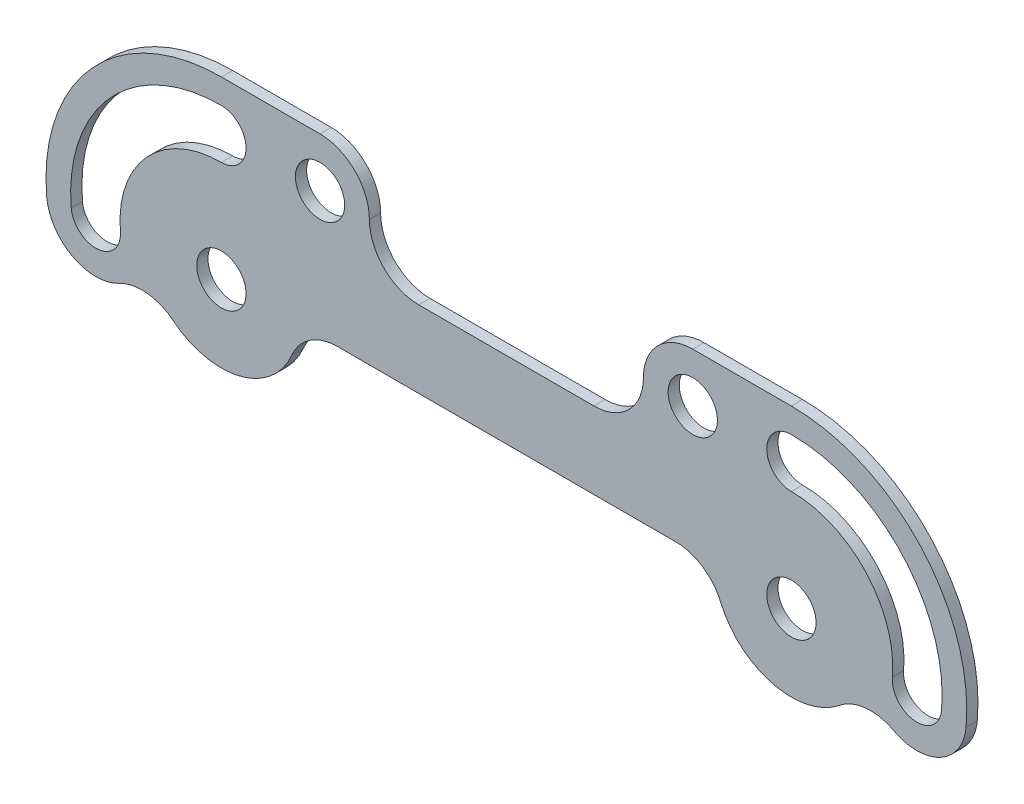
ISO-10303-21;
HEADER;
FILE_DESCRIPTION(('STEP AP214'),'2;1');
FILE_NAME('part.step','',(''),(''),'','','');
FILE_SCHEMA(('AUTOMOTIVE_DESIGN { 1 0 10303 214 1 1 1 1 }'));
ENDSEC;
DATA;
#1=APPLICATION_CONTEXT('core data for automotive mechanical design processes');
#2=APPLICATION_PROTOCOL_DEFINITION('international standard','automotive_design',2000,#1);
#3=PRODUCT_CONTEXT('',#1,'mechanical');
#4=PRODUCT('Part','Part','',(#3));
#5=PRODUCT_RELATED_PRODUCT_CATEGORY('part','',(#4));
#6=PRODUCT_DEFINITION_FORMATION('','',#4);
#7=PRODUCT_DEFINITION_CONTEXT('part definition',#1,'design');
#8=PRODUCT_DEFINITION('design','',#6,#7);
#9=PRODUCT_DEFINITION_SHAPE('','',#8);
#10=(LENGTH_UNIT() NAMED_UNIT(*) SI_UNIT(.MILLI.,.METRE.));
#11=(NAMED_UNIT(*) PLANE_ANGLE_UNIT() SI_UNIT($,.RADIAN.));
#12=(NAMED_UNIT(*) SI_UNIT($,.STERADIAN.) SOLID_ANGLE_UNIT());
#13=UNCERTAINTY_MEASURE_WITH_UNIT(LENGTH_MEASURE(1.E-05),#10,'distance_accuracy_value','');
#14=(GEOMETRIC_REPRESENTATION_CONTEXT(3) GLOBAL_UNCERTAINTY_ASSIGNED_CONTEXT((#13)) GLOBAL_UNIT_ASSIGNED_CONTEXT((#10,
#11,#12)) REPRESENTATION_CONTEXT('',''));
#15=CARTESIAN_POINT('',(0.,0.,0.));
#16=DIRECTION('',(0.,0.,1.));
#17=DIRECTION('',(1.,0.,0.));
#18=AXIS2_PLACEMENT_3D('',#15,#16,#17);
#19=CARTESIAN_POINT('',(-9.09338972851872,-0.795568514268438,0.8128));
#20=DIRECTION('',(0.,0.,-1.));
#21=DIRECTION('',(-1.,0.,0.));
#22=AXIS2_PLACEMENT_3D('',#19,#20,#21);
#23=CYLINDRICAL_SURFACE('',#22,1.7859375);
#24=CARTESIAN_POINT('',(-9.09338972851872,-0.795568514268438,0.));
#25=DIRECTION('',(0.,0.,1.));
#26=DIRECTION('',(1.,0.,0.));
#27=AXIS2_PLACEMENT_3D('',#24,#25,#26);
#28=CIRCLE('',#27,1.7859375);
#29=CARTESIAN_POINT('',(-10.8725311971419,-0.951223223581828,0.));
#30=VERTEX_POINT('',#29);
#31=CARTESIAN_POINT('',(-7.31424825989549,-0.639913804955048,0.));
#32=VERTEX_POINT('',#31);
#33=EDGE_CURVE('E357',#30,#32,#28,.T.);
#34=ORIENTED_EDGE('',*,*,#33,.F.);
#35=DIRECTION('',(0.,0.,-1.));
#36=VECTOR('',#35,1.);
#37=CARTESIAN_POINT('',(-10.8725311971419,-0.951223223581828,0.8128));
#38=LINE('',#37,#36);
#39=CARTESIAN_POINT('',(-10.8725311971419,-0.951223223581828,0.8128));
#40=VERTEX_POINT('',#39);
#41=EDGE_CURVE('E11',#40,#30,#38,.T.);
#42=ORIENTED_EDGE('',*,*,#41,.F.);
#43=CARTESIAN_POINT('',(-9.09338972851872,-0.795568514268438,0.8128));
#44=DIRECTION('',(0.,0.,1.));
#45=DIRECTION('',(1.,0.,0.));
#46=AXIS2_PLACEMENT_3D('',#43,#44,#45);
#47=CIRCLE('',#46,1.7859375);
#48=CARTESIAN_POINT('',(-7.31424825989549,-0.639913804955048,0.8128));
#49=VERTEX_POINT('',#48);
#50=EDGE_CURVE('E232',#40,#49,#47,.T.);
#51=ORIENTED_EDGE('',*,*,#50,.T.);
#52=DIRECTION('',(0.,0.,-1.));
#53=VECTOR('',#52,1.);
#54=CARTESIAN_POINT('',(-7.31424825989549,-0.639913804955048,0.8128));
#55=LINE('',#54,#53);
#56=EDGE_CURVE('E61',#49,#32,#55,.T.);
#57=ORIENTED_EDGE('',*,*,#56,.T.);
#58=EDGE_LOOP('',(#34,#42,#51,#57));
#59=FACE_BOUND('',#58,.T.);
#60=ADVANCED_FACE('F41',(#59),#23,.F.);
#61=CARTESIAN_POINT('',(0.,0.,0.8128));
#62=DIRECTION('',(0.,0.,-1.));
#63=DIRECTION('',(-1.,0.,0.));
#64=AXIS2_PLACEMENT_3D('',#61,#62,#63);
#65=CYLINDRICAL_SURFACE('',#64,10.9140625);
#66=CARTESIAN_POINT('',(0.,0.,0.));
#67=DIRECTION('',(0.,0.,1.));
#68=DIRECTION('',(1.,0.,0.));
#69=AXIS2_PLACEMENT_3D('',#66,#67,#68);
#70=CIRCLE('',#69,10.9140625);
#71=CARTESIAN_POINT('',(0.,10.9140625,0.));
#72=VERTEX_POINT('',#71);
#73=EDGE_CURVE('E239',#30,#72,#70,.F.);
#74=ORIENTED_EDGE('',*,*,#73,.T.);
#75=DIRECTION('',(0.,0.,-1.));
#76=VECTOR('',#75,1.);
#77=CARTESIAN_POINT('',(0.,10.9140625,0.8128));
#78=LINE('',#77,#76);
#79=CARTESIAN_POINT('',(0.,10.9140625,0.8128));
#80=VERTEX_POINT('',#79);
#81=EDGE_CURVE('E52',#80,#72,#78,.T.);
#82=ORIENTED_EDGE('',*,*,#81,.F.);
#83=CARTESIAN_POINT('',(0.,0.,0.8128));
#84=DIRECTION('',(0.,0.,1.));
#85=DIRECTION('',(1.,0.,0.));
#86=AXIS2_PLACEMENT_3D('',#83,#84,#85);
#87=CIRCLE('',#86,10.9140625);
#88=EDGE_CURVE('E225',#40,#80,#87,.F.);
#89=ORIENTED_EDGE('',*,*,#88,.F.);
#90=ORIENTED_EDGE('',*,*,#41,.T.);
#91=EDGE_LOOP('',(#74,#82,#89,#90));
#92=FACE_BOUND('',#91,.T.);
#93=ADVANCED_FACE('F237',(#92),#65,.F.);
#94=CARTESIAN_POINT('',(0.,9.128125,0.8128));
#95=DIRECTION('',(0.,0.,-1.));
#96=DIRECTION('',(-1.,0.,0.));
#97=AXIS2_PLACEMENT_3D('',#94,#95,#96);
#98=CYLINDRICAL_SURFACE('',#97,1.7859375);
#99=CARTESIAN_POINT('',(0.,9.128125,0.));
#100=DIRECTION('',(0.,0.,1.));
#101=DIRECTION('',(1.,0.,0.));
#102=AXIS2_PLACEMENT_3D('',#99,#100,#101);
#103=CIRCLE('',#102,1.7859375);
#104=CARTESIAN_POINT('',(0.,7.3421875,0.));
#105=VERTEX_POINT('',#104);
#106=EDGE_CURVE('E362',#105,#72,#103,.T.);
#107=ORIENTED_EDGE('',*,*,#106,.F.);
#108=DIRECTION('',(0.,0.,-1.));
#109=VECTOR('',#108,1.);
#110=CARTESIAN_POINT('',(0.,7.3421875,0.8128));
#111=LINE('',#110,#109);
#112=CARTESIAN_POINT('',(0.,7.3421875,0.8128));
#113=VERTEX_POINT('',#112);
#114=EDGE_CURVE('E140',#113,#105,#111,.T.);
#115=ORIENTED_EDGE('',*,*,#114,.F.);
#116=CARTESIAN_POINT('',(0.,9.128125,0.8128));
#117=DIRECTION('',(0.,0.,1.));
#118=DIRECTION('',(1.,0.,0.));
#119=AXIS2_PLACEMENT_3D('',#116,#117,#118);
#120=CIRCLE('',#119,1.7859375);
#121=EDGE_CURVE('E231',#113,#80,#120,.T.);
#122=ORIENTED_EDGE('',*,*,#121,.T.);
#123=ORIENTED_EDGE('',*,*,#81,.T.);
#124=EDGE_LOOP('',(#107,#115,#122,#123));
#125=FACE_BOUND('',#124,.T.);
#126=ADVANCED_FACE('F244',(#125),#98,.F.);
#127=CARTESIAN_POINT('',(0.,0.,0.8128));
#128=DIRECTION('',(0.,0.,-1.));
#129=DIRECTION('',(-1.,0.,0.));
#130=AXIS2_PLACEMENT_3D('',#127,#128,#129);
#131=CYLINDRICAL_SURFACE('',#130,12.7);
#132=CARTESIAN_POINT('',(0.,0.,0.));
#133=DIRECTION('',(0.,0.,1.));
#134=DIRECTION('',(1.,0.,0.));
#135=AXIS2_PLACEMENT_3D('',#132,#133,#134);
#136=CIRCLE('',#135,12.7);
#137=CARTESIAN_POINT('',(-12.6516726657652,-1.10687793289522,0.));
#138=VERTEX_POINT('',#137);
#139=CARTESIAN_POINT('',(0.,12.7,0.));
#140=VERTEX_POINT('',#139);
#141=EDGE_CURVE('E285',#138,#140,#136,.F.);
#142=ORIENTED_EDGE('',*,*,#141,.F.);
#143=DIRECTION('',(0.,0.,-1.));
#144=VECTOR('',#143,1.);
#145=CARTESIAN_POINT('',(-12.6516726657652,-1.10687793289522,0.8128));
#146=LINE('',#145,#144);
#147=CARTESIAN_POINT('',(-12.6516726657652,-1.10687793289522,0.8128));
#148=VERTEX_POINT('',#147);
#149=EDGE_CURVE('E387',#148,#138,#146,.T.);
#150=ORIENTED_EDGE('',*,*,#149,.F.);
#151=CARTESIAN_POINT('',(0.,0.,0.8128));
#152=DIRECTION('',(0.,0.,1.));
#153=DIRECTION('',(1.,0.,0.));
#154=AXIS2_PLACEMENT_3D('',#151,#152,#153);
#155=CIRCLE('',#154,12.7);
#156=CARTESIAN_POINT('',(0.,12.7,0.8128));
#157=VERTEX_POINT('',#156);
#158=EDGE_CURVE('E475',#148,#157,#155,.F.);
#159=ORIENTED_EDGE('',*,*,#158,.T.);
#160=DIRECTION('',(0.,0.,-1.));
#161=VECTOR('',#160,1.);
#162=CARTESIAN_POINT('',(0.,12.7,0.8128));
#163=LINE('',#162,#161);
#164=EDGE_CURVE('E390',#157,#140,#163,.T.);
#165=ORIENTED_EDGE('',*,*,#164,.T.);
#166=EDGE_LOOP('',(#142,#150,#159,#165));
#167=FACE_BOUND('',#166,.T.);
#168=ADVANCED_FACE('F628',(#167),#131,.T.);
#169=CARTESIAN_POINT('',(-9.09338972851872,-0.795568514268438,0.8128));
#170=DIRECTION('',(0.,0.,-1.));
#171=DIRECTION('',(-1.,0.,0.));
#172=AXIS2_PLACEMENT_3D('',#169,#170,#171);
#173=CYLINDRICAL_SURFACE('',#172,3.571875);
#174=CARTESIAN_POINT('',(-9.09338972851872,-0.795568514268438,0.));
#175=DIRECTION('',(0.,0.,1.));
#176=DIRECTION('',(1.,0.,0.));
#177=AXIS2_PLACEMENT_3D('',#174,#175,#176);
#178=CIRCLE('',#177,3.571875);
#179=CARTESIAN_POINT('',(-7.41453212612539,-3.94830195788703,0.));
#180=VERTEX_POINT('',#179);
#181=EDGE_CURVE('E289',#138,#180,#178,.T.);
#182=ORIENTED_EDGE('',*,*,#181,.T.);
#183=DIRECTION('',(0.,0.,-1.));
#184=VECTOR('',#183,1.);
#185=CARTESIAN_POINT('',(-7.41453212612539,-3.94830195788703,0.8128));
#186=LINE('',#185,#184);
#187=CARTESIAN_POINT('',(-7.41453212612539,-3.94830195788703,0.8128));
#188=VERTEX_POINT('',#187);
#189=EDGE_CURVE('E438',#188,#180,#186,.T.);
#190=ORIENTED_EDGE('',*,*,#189,.F.);
#191=CARTESIAN_POINT('',(-9.09338972851872,-0.795568514268438,0.8128));
#192=DIRECTION('',(0.,0.,1.));
#193=DIRECTION('',(1.,0.,0.));
#194=AXIS2_PLACEMENT_3D('',#191,#192,#193);
#195=CIRCLE('',#194,3.571875);
#196=EDGE_CURVE('E479',#148,#188,#195,.T.);
#197=ORIENTED_EDGE('',*,*,#196,.F.);
#198=ORIENTED_EDGE('',*,*,#149,.T.);
#199=EDGE_LOOP('',(#182,#190,#197,#198));
#200=FACE_BOUND('',#199,.T.);
#201=ADVANCED_FACE('F624',(#200),#173,.T.);
#202=CARTESIAN_POINT('',(-5.73567452373206,-7.10103540150561,0.8128));
#203=DIRECTION('',(0.,0.,-1.));
#204=DIRECTION('',(-1.,0.,0.));
#205=AXIS2_PLACEMENT_3D('',#202,#203,#204);
#206=CYLINDRICAL_SURFACE('',#205,3.571875);
#207=CARTESIAN_POINT('',(-5.73567452373206,-7.10103540150561,0.));
#208=DIRECTION('',(0.,0.,1.));
#209=DIRECTION('',(1.,0.,0.));
#210=AXIS2_PLACEMENT_3D('',#207,#208,#209);
#211=CIRCLE('',#210,3.571875);
#212=CARTESIAN_POINT('',(-3.49128014488038,-4.3223693748295,0.));
#213=VERTEX_POINT('',#212);
#214=EDGE_CURVE('E293',#213,#180,#211,.T.);
#215=ORIENTED_EDGE('',*,*,#214,.F.);
#216=DIRECTION('',(0.,0.,-1.));
#217=VECTOR('',#216,1.);
#218=CARTESIAN_POINT('',(-3.49128014488038,-4.3223693748295,0.8128));
#219=LINE('',#218,#217);
#220=CARTESIAN_POINT('',(-3.49128014488038,-4.3223693748295,0.8128));
#221=VERTEX_POINT('',#220);
#222=EDGE_CURVE('E435',#221,#213,#219,.T.);
#223=ORIENTED_EDGE('',*,*,#222,.F.);
#224=CARTESIAN_POINT('',(-5.73567452373206,-7.10103540150561,0.8128));
#225=DIRECTION('',(0.,0.,1.));
#226=DIRECTION('',(1.,0.,0.));
#227=AXIS2_PLACEMENT_3D('',#224,#225,#226);
#228=CIRCLE('',#227,3.571875);
#229=EDGE_CURVE('E485',#221,#188,#228,.T.);
#230=ORIENTED_EDGE('',*,*,#229,.T.);
#231=ORIENTED_EDGE('',*,*,#189,.T.);
#232=EDGE_LOOP('',(#215,#223,#230,#231));
#233=FACE_BOUND('',#232,.T.);
#234=ADVANCED_FACE('F620',(#233),#206,.F.);
#235=CARTESIAN_POINT('',(0.,0.,0.8128));
#236=DIRECTION('',(0.,0.,-1.));
#237=DIRECTION('',(-1.,0.,0.));
#238=AXIS2_PLACEMENT_3D('',#235,#236,#237);
#239=CYLINDRICAL_SURFACE('',#238,5.55625);
#240=CARTESIAN_POINT('',(0.,0.,0.));
#241=DIRECTION('',(0.,0.,1.));
#242=DIRECTION('',(1.,0.,0.));
#243=AXIS2_PLACEMENT_3D('',#240,#241,#242);
#244=CIRCLE('',#243,5.55625);
#245=CARTESIAN_POINT('',(5.11320199029657,-2.1741847826087,0.));
#246=VERTEX_POINT('',#245);
#247=EDGE_CURVE('E297',#213,#246,#244,.T.);
#248=ORIENTED_EDGE('',*,*,#247,.T.);
#249=DIRECTION('',(0.,0.,-1.));
#250=VECTOR('',#249,1.);
#251=CARTESIAN_POINT('',(5.11320199029657,-2.1741847826087,0.8128));
#252=LINE('',#251,#250);
#253=CARTESIAN_POINT('',(5.11320199029657,-2.1741847826087,0.8128));
#254=VERTEX_POINT('',#253);
#255=EDGE_CURVE('E432',#254,#246,#252,.T.);
#256=ORIENTED_EDGE('',*,*,#255,.F.);
#257=CARTESIAN_POINT('',(0.,0.,0.8128));
#258=DIRECTION('',(0.,0.,1.));
#259=DIRECTION('',(1.,0.,0.));
#260=AXIS2_PLACEMENT_3D('',#257,#258,#259);
#261=CIRCLE('',#260,5.55625);
#262=EDGE_CURVE('E489',#221,#254,#261,.T.);
#263=ORIENTED_EDGE('',*,*,#262,.F.);
#264=ORIENTED_EDGE('',*,*,#222,.T.);
#265=EDGE_LOOP('',(#248,#256,#263,#264));
#266=FACE_BOUND('',#265,.T.);
#267=ADVANCED_FACE('F616',(#266),#239,.T.);
#268=CARTESIAN_POINT('',(8.40026041263007,-3.571875,0.8128));
#269=DIRECTION('',(0.,0.,-1.));
#270=DIRECTION('',(-1.,0.,0.));
#271=AXIS2_PLACEMENT_3D('',#268,#269,#270);
#272=CYLINDRICAL_SURFACE('',#271,3.571875);
#273=CARTESIAN_POINT('',(8.40026041263007,-3.571875,0.));
#274=DIRECTION('',(0.,0.,1.));
#275=DIRECTION('',(1.,0.,0.));
#276=AXIS2_PLACEMENT_3D('',#273,#274,#275);
#277=CIRCLE('',#276,3.571875);
#278=CARTESIAN_POINT('',(8.40026041263007,0.,0.));
#279=VERTEX_POINT('',#278);
#280=EDGE_CURVE('E301',#279,#246,#277,.T.);
#281=ORIENTED_EDGE('',*,*,#280,.F.);
#282=DIRECTION('',(0.,0.,-1.));
#283=VECTOR('',#282,1.);
#284=CARTESIAN_POINT('',(8.40026041263007,0.,0.8128));
#285=LINE('',#284,#283);
#286=CARTESIAN_POINT('',(8.40026041263007,0.,0.8128));
#287=VERTEX_POINT('',#286);
#288=EDGE_CURVE('E429',#287,#279,#285,.T.);
#289=ORIENTED_EDGE('',*,*,#288,.F.);
#290=CARTESIAN_POINT('',(8.40026041263007,-3.571875,0.8128));
#291=DIRECTION('',(0.,0.,1.));
#292=DIRECTION('',(1.,0.,0.));
#293=AXIS2_PLACEMENT_3D('',#290,#291,#292);
#294=CIRCLE('',#293,3.571875);
#295=EDGE_CURVE('E492',#287,#254,#294,.T.);
#296=ORIENTED_EDGE('',*,*,#295,.T.);
#297=ORIENTED_EDGE('',*,*,#255,.T.);
#298=EDGE_LOOP('',(#281,#289,#296,#297));
#299=FACE_BOUND('',#298,.T.);
#300=ADVANCED_FACE('F612',(#299),#272,.F.);
#301=CARTESIAN_POINT('',(0.,0.,0.8128));
#302=DIRECTION('',(0.,1.,0.));
#303=DIRECTION('',(0.,0.,1.));
#304=AXIS2_PLACEMENT_3D('',#301,#302,#303);
#305=PLANE('',#304);
#306=DIRECTION('',(1.,0.,0.));
#307=VECTOR('',#306,1.);
#308=CARTESIAN_POINT('',(0.,0.,0.));
#309=LINE('',#308,#307);
#310=CARTESIAN_POINT('',(32.8747395873699,0.,0.));
#311=VERTEX_POINT('',#310);
#312=EDGE_CURVE('E305',#279,#311,#309,.T.);
#313=ORIENTED_EDGE('',*,*,#312,.T.);
#314=DIRECTION('',(0.,0.,-1.));
#315=VECTOR('',#314,1.);
#316=CARTESIAN_POINT('',(32.8747395873699,0.,0.8128));
#317=LINE('',#316,#315);
#318=CARTESIAN_POINT('',(32.8747395873699,0.,0.8128));
#319=VERTEX_POINT('',#318);
#320=EDGE_CURVE('E426',#319,#311,#317,.T.);
#321=ORIENTED_EDGE('',*,*,#320,.F.);
#322=DIRECTION('',(1.,0.,0.));
#323=VECTOR('',#322,1.);
#324=CARTESIAN_POINT('',(0.,0.,0.8128));
#325=LINE('',#324,#323);
#326=EDGE_CURVE('E496',#287,#319,#325,.T.);
#327=ORIENTED_EDGE('',*,*,#326,.F.);
#328=ORIENTED_EDGE('',*,*,#288,.T.);
#329=EDGE_LOOP('',(#313,#321,#327,#328));
#330=FACE_BOUND('',#329,.T.);
#331=ADVANCED_FACE('F608',(#330),#305,.F.);
#332=CARTESIAN_POINT('',(32.8747395873699,-3.571875,0.8128));
#333=DIRECTION('',(0.,0.,-1.));
#334=DIRECTION('',(-1.,0.,0.));
#335=AXIS2_PLACEMENT_3D('',#332,#333,#334);
#336=CYLINDRICAL_SURFACE('',#335,3.57187499999999);
#337=CARTESIAN_POINT('',(32.8747395873699,-3.571875,0.));
#338=DIRECTION('',(0.,0.,1.));
#339=DIRECTION('',(1.,0.,0.));
#340=AXIS2_PLACEMENT_3D('',#337,#338,#339);
#341=CIRCLE('',#340,3.57187499999999);
#342=CARTESIAN_POINT('',(36.1617980097034,-2.1741847826087,0.));
#343=VERTEX_POINT('',#342);
#344=EDGE_CURVE('E309',#343,#311,#341,.T.);
#345=ORIENTED_EDGE('',*,*,#344,.F.);
#346=DIRECTION('',(0.,0.,-1.));
#347=VECTOR('',#346,1.);
#348=CARTESIAN_POINT('',(36.1617980097034,-2.1741847826087,0.8128));
#349=LINE('',#348,#347);
#350=CARTESIAN_POINT('',(36.1617980097034,-2.1741847826087,0.8128));
#351=VERTEX_POINT('',#350);
#352=EDGE_CURVE('E423',#351,#343,#349,.T.);
#353=ORIENTED_EDGE('',*,*,#352,.F.);
#354=CARTESIAN_POINT('',(32.8747395873699,-3.571875,0.8128));
#355=DIRECTION('',(0.,0.,1.));
#356=DIRECTION('',(1.,0.,0.));
#357=AXIS2_PLACEMENT_3D('',#354,#355,#356);
#358=CIRCLE('',#357,3.57187499999999);
#359=EDGE_CURVE('E499',#351,#319,#358,.T.);
#360=ORIENTED_EDGE('',*,*,#359,.T.);
#361=ORIENTED_EDGE('',*,*,#320,.T.);
#362=EDGE_LOOP('',(#345,#353,#360,#361));
#363=FACE_BOUND('',#362,.T.);
#364=ADVANCED_FACE('F604',(#363),#336,.F.);
#365=CARTESIAN_POINT('',(41.275,0.,0.8128));
#366=DIRECTION('',(0.,0.,-1.));
#367=DIRECTION('',(-1.,0.,0.));
#368=AXIS2_PLACEMENT_3D('',#365,#366,#367);
#369=CYLINDRICAL_SURFACE('',#368,5.55625);
#370=CARTESIAN_POINT('',(41.275,0.,0.));
#371=DIRECTION('',(0.,0.,1.));
#372=DIRECTION('',(1.,0.,0.));
#373=AXIS2_PLACEMENT_3D('',#370,#371,#372);
#374=CIRCLE('',#373,5.55625);
#375=CARTESIAN_POINT('',(44.7662801448804,-4.3223693748295,0.));
#376=VERTEX_POINT('',#375);
#377=EDGE_CURVE('E313',#343,#376,#374,.T.);
#378=ORIENTED_EDGE('',*,*,#377,.T.);
#379=DIRECTION('',(0.,0.,-1.));
#380=VECTOR('',#379,1.);
#381=CARTESIAN_POINT('',(44.7662801448804,-4.3223693748295,0.8128));
#382=LINE('',#381,#380);
#383=CARTESIAN_POINT('',(44.7662801448804,-4.3223693748295,0.8128));
#384=VERTEX_POINT('',#383);
#385=EDGE_CURVE('E420',#384,#376,#382,.T.);
#386=ORIENTED_EDGE('',*,*,#385,.F.);
#387=CARTESIAN_POINT('',(41.275,0.,0.8128));
#388=DIRECTION('',(0.,0.,1.));
#389=DIRECTION('',(1.,0.,0.));
#390=AXIS2_PLACEMENT_3D('',#387,#388,#389);
#391=CIRCLE('',#390,5.55625);
#392=EDGE_CURVE('E503',#351,#384,#391,.T.);
#393=ORIENTED_EDGE('',*,*,#392,.F.);
#394=ORIENTED_EDGE('',*,*,#352,.T.);
#395=EDGE_LOOP('',(#378,#386,#393,#394));
#396=FACE_BOUND('',#395,.T.);
#397=ADVANCED_FACE('F600',(#396),#369,.T.);
#398=CARTESIAN_POINT('',(47.0106745237321,-7.10103540150561,0.8128));
#399=DIRECTION('',(0.,0.,-1.));
#400=DIRECTION('',(-1.,0.,0.));
#401=AXIS2_PLACEMENT_3D('',#398,#399,#400);
#402=CYLINDRICAL_SURFACE('',#401,3.571875);
#403=CARTESIAN_POINT('',(47.0106745237321,-7.10103540150561,0.));
#404=DIRECTION('',(0.,0.,1.));
#405=DIRECTION('',(1.,0.,0.));
#406=AXIS2_PLACEMENT_3D('',#403,#404,#405);
#407=CIRCLE('',#406,3.571875);
#408=CARTESIAN_POINT('',(48.6895321261254,-3.94830195788702,0.));
#409=VERTEX_POINT('',#408);
#410=EDGE_CURVE('E317',#409,#376,#407,.T.);
#411=ORIENTED_EDGE('',*,*,#410,.F.);
#412=DIRECTION('',(0.,0.,-1.));
#413=VECTOR('',#412,1.);
#414=CARTESIAN_POINT('',(48.6895321261254,-3.94830195788702,0.8128));
#415=LINE('',#414,#413);
#416=CARTESIAN_POINT('',(48.6895321261254,-3.94830195788702,0.8128));
#417=VERTEX_POINT('',#416);
#418=EDGE_CURVE('E417',#417,#409,#415,.T.);
#419=ORIENTED_EDGE('',*,*,#418,.F.);
#420=CARTESIAN_POINT('',(47.0106745237321,-7.10103540150561,0.8128));
#421=DIRECTION('',(0.,0.,1.));
#422=DIRECTION('',(1.,0.,0.));
#423=AXIS2_PLACEMENT_3D('',#420,#421,#422);
#424=CIRCLE('',#423,3.571875);
#425=EDGE_CURVE('E506',#417,#384,#424,.T.);
#426=ORIENTED_EDGE('',*,*,#425,.T.);
#427=ORIENTED_EDGE('',*,*,#385,.T.);
#428=EDGE_LOOP('',(#411,#419,#426,#427));
#429=FACE_BOUND('',#428,.T.);
#430=ADVANCED_FACE('F596',(#429),#402,.F.);
#431=CARTESIAN_POINT('',(50.3683897285187,-0.795568514268432,0.8128));
#432=DIRECTION('',(0.,0.,-1.));
#433=DIRECTION('',(-1.,0.,0.));
#434=AXIS2_PLACEMENT_3D('',#431,#432,#433);
#435=CYLINDRICAL_SURFACE('',#434,3.571875);
#436=CARTESIAN_POINT('',(50.3683897285187,-0.795568514268432,0.));
#437=DIRECTION('',(0.,0.,1.));
#438=DIRECTION('',(1.,0.,0.));
#439=AXIS2_PLACEMENT_3D('',#436,#437,#438);
#440=CIRCLE('',#439,3.571875);
#441=CARTESIAN_POINT('',(53.9266726657652,-1.10687793289521,0.));
#442=VERTEX_POINT('',#441);
#443=EDGE_CURVE('E321',#409,#442,#440,.T.);
#444=ORIENTED_EDGE('',*,*,#443,.T.);
#445=DIRECTION('',(0.,0.,-1.));
#446=VECTOR('',#445,1.);
#447=CARTESIAN_POINT('',(53.9266726657652,-1.10687793289521,0.8128));
#448=LINE('',#447,#446);
#449=CARTESIAN_POINT('',(53.9266726657652,-1.10687793289521,0.8128));
#450=VERTEX_POINT('',#449);
#451=EDGE_CURVE('E414',#450,#442,#448,.T.);
#452=ORIENTED_EDGE('',*,*,#451,.F.);
#453=CARTESIAN_POINT('',(50.3683897285187,-0.795568514268432,0.8128));
#454=DIRECTION('',(0.,0.,1.));
#455=DIRECTION('',(1.,0.,0.));
#456=AXIS2_PLACEMENT_3D('',#453,#454,#455);
#457=CIRCLE('',#456,3.571875);
#458=EDGE_CURVE('E510',#417,#450,#457,.T.);
#459=ORIENTED_EDGE('',*,*,#458,.F.);
#460=ORIENTED_EDGE('',*,*,#418,.T.);
#461=EDGE_LOOP('',(#444,#452,#459,#460));
#462=FACE_BOUND('',#461,.T.);
#463=ADVANCED_FACE('F592',(#462),#435,.T.);
#464=CARTESIAN_POINT('',(41.275,0.,0.8128));
#465=DIRECTION('',(0.,0.,-1.));
#466=DIRECTION('',(-1.,0.,0.));
#467=AXIS2_PLACEMENT_3D('',#464,#465,#466);
#468=CYLINDRICAL_SURFACE('',#467,12.7);
#469=CARTESIAN_POINT('',(41.275,0.,0.));
#470=DIRECTION('',(0.,0.,1.));
#471=DIRECTION('',(1.,0.,0.));
#472=AXIS2_PLACEMENT_3D('',#469,#470,#471);
#473=CIRCLE('',#472,12.7);
#474=CARTESIAN_POINT('',(41.275,12.7,0.));
#475=VERTEX_POINT('',#474);
#476=EDGE_CURVE('E325',#475,#442,#473,.F.);
#477=ORIENTED_EDGE('',*,*,#476,.F.);
#478=DIRECTION('',(0.,0.,-1.));
#479=VECTOR('',#478,1.);
#480=CARTESIAN_POINT('',(41.275,12.7,0.8128));
#481=LINE('',#480,#479);
#482=CARTESIAN_POINT('',(41.275,12.7,0.8128));
#483=VERTEX_POINT('',#482);
#484=EDGE_CURVE('E411',#483,#475,#481,.T.);
#485=ORIENTED_EDGE('',*,*,#484,.F.);
#486=CARTESIAN_POINT('',(41.275,0.,0.8128));
#487=DIRECTION('',(0.,0.,1.));
#488=DIRECTION('',(1.,0.,0.));
#489=AXIS2_PLACEMENT_3D('',#486,#487,#488);
#490=CIRCLE('',#489,12.7);
#491=EDGE_CURVE('E513',#483,#450,#490,.F.);
#492=ORIENTED_EDGE('',*,*,#491,.T.);
#493=ORIENTED_EDGE('',*,*,#451,.T.);
#494=EDGE_LOOP('',(#477,#485,#492,#493));
#495=FACE_BOUND('',#494,.T.);
#496=ADVANCED_FACE('F588',(#495),#468,.T.);
#497=CARTESIAN_POINT('',(0.,12.7,0.8128));
#498=DIRECTION('',(0.,1.,0.));
#499=DIRECTION('',(-1.,0.,0.));
#500=AXIS2_PLACEMENT_3D('',#497,#498,#499);
#501=PLANE('',#500);
#502=DIRECTION('',(1.,0.,0.));
#503=VECTOR('',#502,1.);
#504=CARTESIAN_POINT('',(0.,12.7,0.));
#505=LINE('',#504,#503);
#506=CARTESIAN_POINT('',(34.13125,12.7,0.));
#507=VERTEX_POINT('',#506);
#508=EDGE_CURVE('E329',#507,#475,#505,.T.);
#509=ORIENTED_EDGE('',*,*,#508,.F.);
#510=DIRECTION('',(0.,0.,-1.));
#511=VECTOR('',#510,1.);
#512=CARTESIAN_POINT('',(34.13125,12.7,0.8128));
#513=LINE('',#512,#511);
#514=CARTESIAN_POINT('',(34.13125,12.7,0.8128));
#515=VERTEX_POINT('',#514);
#516=EDGE_CURVE('E408',#515,#507,#513,.T.);
#517=ORIENTED_EDGE('',*,*,#516,.F.);
#518=DIRECTION('',(1.,0.,0.));
#519=VECTOR('',#518,1.);
#520=CARTESIAN_POINT('',(0.,12.7,0.8128));
#521=LINE('',#520,#519);
#522=EDGE_CURVE('E517',#515,#483,#521,.T.);
#523=ORIENTED_EDGE('',*,*,#522,.T.);
#524=ORIENTED_EDGE('',*,*,#484,.T.);
#525=EDGE_LOOP('',(#509,#517,#523,#524));
#526=FACE_BOUND('',#525,.T.);
#527=ADVANCED_FACE('F584',(#526),#501,.T.);
#528=CARTESIAN_POINT('',(34.13125,9.128125,0.8128));
#529=DIRECTION('',(0.,0.,-1.));
#530=DIRECTION('',(-1.,0.,0.));
#531=AXIS2_PLACEMENT_3D('',#528,#529,#530);
#532=CYLINDRICAL_SURFACE('',#531,3.571875);
#533=CARTESIAN_POINT('',(34.13125,9.128125,0.));
#534=DIRECTION('',(0.,0.,1.));
#535=DIRECTION('',(1.,0.,0.));
#536=AXIS2_PLACEMENT_3D('',#533,#534,#535);
#537=CIRCLE('',#536,3.571875);
#538=CARTESIAN_POINT('',(30.559375,9.128125,0.));
#539=VERTEX_POINT('',#538);
#540=EDGE_CURVE('E333',#507,#539,#537,.T.);
#541=ORIENTED_EDGE('',*,*,#540,.T.);
#542=DIRECTION('',(0.,0.,-1.));
#543=VECTOR('',#542,1.);
#544=CARTESIAN_POINT('',(30.559375,9.128125,0.8128));
#545=LINE('',#544,#543);
#546=CARTESIAN_POINT('',(30.559375,9.128125,0.8128));
#547=VERTEX_POINT('',#546);
#548=EDGE_CURVE('E405',#547,#539,#545,.T.);
#549=ORIENTED_EDGE('',*,*,#548,.F.);
#550=CARTESIAN_POINT('',(34.13125,9.128125,0.8128));
#551=DIRECTION('',(0.,0.,1.));
#552=DIRECTION('',(1.,0.,0.));
#553=AXIS2_PLACEMENT_3D('',#550,#551,#552);
#554=CIRCLE('',#553,3.571875);
#555=EDGE_CURVE('E521',#515,#547,#554,.T.);
#556=ORIENTED_EDGE('',*,*,#555,.F.);
#557=ORIENTED_EDGE('',*,*,#516,.T.);
#558=EDGE_LOOP('',(#541,#549,#556,#557));
#559=FACE_BOUND('',#558,.T.);
#560=ADVANCED_FACE('F580',(#559),#532,.T.);
#561=CARTESIAN_POINT('',(26.9875,9.128125,0.8128));
#562=DIRECTION('',(0.,0.,-1.));
#563=DIRECTION('',(-1.,0.,0.));
#564=AXIS2_PLACEMENT_3D('',#561,#562,#563);
#565=CYLINDRICAL_SURFACE('',#564,3.571875);
#566=CARTESIAN_POINT('',(26.9875,9.128125,0.));
#567=DIRECTION('',(0.,0.,1.));
#568=DIRECTION('',(1.,0.,0.));
#569=AXIS2_PLACEMENT_3D('',#566,#567,#568);
#570=CIRCLE('',#569,3.571875);
#571=CARTESIAN_POINT('',(26.9875,5.55625,0.));
#572=VERTEX_POINT('',#571);
#573=EDGE_CURVE('E337',#572,#539,#570,.T.);
#574=ORIENTED_EDGE('',*,*,#573,.F.);
#575=DIRECTION('',(0.,0.,-1.));
#576=VECTOR('',#575,1.);
#577=CARTESIAN_POINT('',(26.9875,5.55625,0.8128));
#578=LINE('',#577,#576);
#579=CARTESIAN_POINT('',(26.9875,5.55625,0.8128));
#580=VERTEX_POINT('',#579);
#581=EDGE_CURVE('E402',#580,#572,#578,.T.);
#582=ORIENTED_EDGE('',*,*,#581,.F.);
#583=CARTESIAN_POINT('',(26.9875,9.128125,0.8128));
#584=DIRECTION('',(0.,0.,1.));
#585=DIRECTION('',(1.,0.,0.));
#586=AXIS2_PLACEMENT_3D('',#583,#584,#585);
#587=CIRCLE('',#586,3.571875);
#588=EDGE_CURVE('E524',#580,#547,#587,.T.);
#589=ORIENTED_EDGE('',*,*,#588,.T.);
#590=ORIENTED_EDGE('',*,*,#548,.T.);
#591=EDGE_LOOP('',(#574,#582,#589,#590));
#592=FACE_BOUND('',#591,.T.);
#593=ADVANCED_FACE('F576',(#592),#565,.F.);
#594=CARTESIAN_POINT('',(0.,5.55625,0.8128));
#595=DIRECTION('',(0.,1.,0.));
#596=DIRECTION('',(0.,0.,1.));
#597=AXIS2_PLACEMENT_3D('',#594,#595,#596);
#598=PLANE('',#597);
#599=DIRECTION('',(1.,0.,0.));
#600=VECTOR('',#599,1.);
#601=CARTESIAN_POINT('',(0.,5.55625,0.));
#602=LINE('',#601,#600);
#603=CARTESIAN_POINT('',(14.2875,5.55625,0.));
#604=VERTEX_POINT('',#603);
#605=EDGE_CURVE('E341',#604,#572,#602,.T.);
#606=ORIENTED_EDGE('',*,*,#605,.F.);
#607=DIRECTION('',(0.,0.,-1.));
#608=VECTOR('',#607,1.);
#609=CARTESIAN_POINT('',(14.2875,5.55625,0.8128));
#610=LINE('',#609,#608);
#611=CARTESIAN_POINT('',(14.2875,5.55625,0.8128));
#612=VERTEX_POINT('',#611);
#613=EDGE_CURVE('E399',#612,#604,#610,.T.);
#614=ORIENTED_EDGE('',*,*,#613,.F.);
#615=DIRECTION('',(1.,0.,0.));
#616=VECTOR('',#615,1.);
#617=CARTESIAN_POINT('',(0.,5.55625,0.8128));
#618=LINE('',#617,#616);
#619=EDGE_CURVE('E528',#612,#580,#618,.T.);
#620=ORIENTED_EDGE('',*,*,#619,.T.);
#621=ORIENTED_EDGE('',*,*,#581,.T.);
#622=EDGE_LOOP('',(#606,#614,#620,#621));
#623=FACE_BOUND('',#622,.T.);
#624=ADVANCED_FACE('F572',(#623),#598,.T.);
#625=CARTESIAN_POINT('',(14.2875,9.128125,0.8128));
#626=DIRECTION('',(0.,0.,-1.));
#627=DIRECTION('',(-1.,0.,0.));
#628=AXIS2_PLACEMENT_3D('',#625,#626,#627);
#629=CYLINDRICAL_SURFACE('',#628,3.571875);
#630=CARTESIAN_POINT('',(14.2875,9.128125,0.));
#631=DIRECTION('',(0.,0.,1.));
#632=DIRECTION('',(1.,0.,0.));
#633=AXIS2_PLACEMENT_3D('',#630,#631,#632);
#634=CIRCLE('',#633,3.571875);
#635=CARTESIAN_POINT('',(10.715625,9.128125,0.));
#636=VERTEX_POINT('',#635);
#637=EDGE_CURVE('E345',#636,#604,#634,.T.);
#638=ORIENTED_EDGE('',*,*,#637,.F.);
#639=DIRECTION('',(0.,0.,-1.));
#640=VECTOR('',#639,1.);
#641=CARTESIAN_POINT('',(10.715625,9.128125,0.8128));
#642=LINE('',#641,#640);
#643=CARTESIAN_POINT('',(10.715625,9.128125,0.8128));
#644=VERTEX_POINT('',#643);
#645=EDGE_CURVE('E396',#644,#636,#642,.T.);
#646=ORIENTED_EDGE('',*,*,#645,.F.);
#647=CARTESIAN_POINT('',(14.2875,9.128125,0.8128));
#648=DIRECTION('',(0.,0.,1.));
#649=DIRECTION('',(1.,0.,0.));
#650=AXIS2_PLACEMENT_3D('',#647,#648,#649);
#651=CIRCLE('',#650,3.571875);
#652=EDGE_CURVE('E532',#644,#612,#651,.T.);
#653=ORIENTED_EDGE('',*,*,#652,.T.);
#654=ORIENTED_EDGE('',*,*,#613,.T.);
#655=EDGE_LOOP('',(#638,#646,#653,#654));
#656=FACE_BOUND('',#655,.T.);
#657=ADVANCED_FACE('F568',(#656),#629,.F.);
#658=CARTESIAN_POINT('',(7.14375,9.128125,0.8128));
#659=DIRECTION('',(0.,0.,-1.));
#660=DIRECTION('',(-1.,0.,0.));
#661=AXIS2_PLACEMENT_3D('',#658,#659,#660);
#662=CYLINDRICAL_SURFACE('',#661,3.571875);
#663=CARTESIAN_POINT('',(7.14375,9.128125,0.));
#664=DIRECTION('',(0.,0.,1.));
#665=DIRECTION('',(1.,0.,0.));
#666=AXIS2_PLACEMENT_3D('',#663,#664,#665);
#667=CIRCLE('',#666,3.571875);
#668=CARTESIAN_POINT('',(7.14375,12.7,0.));
#669=VERTEX_POINT('',#668);
#670=EDGE_CURVE('E349',#636,#669,#667,.T.);
#671=ORIENTED_EDGE('',*,*,#670,.T.);
#672=DIRECTION('',(0.,0.,-1.));
#673=VECTOR('',#672,1.);
#674=CARTESIAN_POINT('',(7.14375,12.7,0.8128));
#675=LINE('',#674,#673);
#676=CARTESIAN_POINT('',(7.14375,12.7,0.8128));
#677=VERTEX_POINT('',#676);
#678=EDGE_CURVE('E393',#677,#669,#675,.T.);
#679=ORIENTED_EDGE('',*,*,#678,.F.);
#680=CARTESIAN_POINT('',(7.14375,9.128125,0.8128));
#681=DIRECTION('',(0.,0.,1.));
#682=DIRECTION('',(1.,0.,0.));
#683=AXIS2_PLACEMENT_3D('',#680,#681,#682);
#684=CIRCLE('',#683,3.571875);
#685=EDGE_CURVE('E536',#644,#677,#684,.T.);
#686=ORIENTED_EDGE('',*,*,#685,.F.);
#687=ORIENTED_EDGE('',*,*,#645,.T.);
#688=EDGE_LOOP('',(#671,#679,#686,#687));
#689=FACE_BOUND('',#688,.T.);
#690=ADVANCED_FACE('F565',(#689),#662,.T.);
#691=CARTESIAN_POINT('',(41.275,0.,0.8128));
#692=DIRECTION('',(0.,0.,-1.));
#693=DIRECTION('',(-1.,0.,0.));
#694=AXIS2_PLACEMENT_3D('',#691,#692,#693);
#695=CYLINDRICAL_SURFACE('',#694,10.9140625);
#696=CARTESIAN_POINT('',(41.275,0.,0.));
#697=DIRECTION('',(0.,0.,1.));
#698=DIRECTION('',(1.,0.,0.));
#699=AXIS2_PLACEMENT_3D('',#696,#697,#698);
#700=CIRCLE('',#699,10.9140625);
#701=CARTESIAN_POINT('',(41.275,10.9140625,0.));
#702=VERTEX_POINT('',#701);
#703=CARTESIAN_POINT('',(52.1475311971419,-0.951223223581821,0.));
#704=VERTEX_POINT('',#703);
#705=EDGE_CURVE('E269',#702,#704,#700,.F.);
#706=ORIENTED_EDGE('',*,*,#705,.T.);
#707=DIRECTION('',(0.,0.,-1.));
#708=VECTOR('',#707,1.);
#709=CARTESIAN_POINT('',(52.1475311971419,-0.951223223581821,0.8128));
#710=LINE('',#709,#708);
#711=CARTESIAN_POINT('',(52.1475311971419,-0.951223223581821,0.8128));
#712=VERTEX_POINT('',#711);
#713=EDGE_CURVE('E45',#712,#704,#710,.T.);
#714=ORIENTED_EDGE('',*,*,#713,.F.);
#715=CARTESIAN_POINT('',(41.275,0.,0.8128));
#716=DIRECTION('',(0.,0.,1.));
#717=DIRECTION('',(1.,0.,0.));
#718=AXIS2_PLACEMENT_3D('',#715,#716,#717);
#719=CIRCLE('',#718,10.9140625);
#720=CARTESIAN_POINT('',(41.275,10.9140625,0.8128));
#721=VERTEX_POINT('',#720);
#722=EDGE_CURVE('E153',#721,#712,#719,.F.);
#723=ORIENTED_EDGE('',*,*,#722,.F.);
#724=DIRECTION('',(0.,0.,-1.));
#725=VECTOR('',#724,1.);
#726=CARTESIAN_POINT('',(41.275,10.9140625,0.8128));
#727=LINE('',#726,#725);
#728=EDGE_CURVE('E268',#721,#702,#727,.T.);
#729=ORIENTED_EDGE('',*,*,#728,.T.);
#730=EDGE_LOOP('',(#706,#714,#723,#729));
#731=FACE_BOUND('',#730,.T.);
#732=ADVANCED_FACE('F43',(#731),#695,.F.);
#733=CARTESIAN_POINT('',(50.3683897285187,-0.795568514268432,0.8128));
#734=DIRECTION('',(0.,0.,-1.));
#735=DIRECTION('',(-1.,0.,0.));
#736=AXIS2_PLACEMENT_3D('',#733,#734,#735);
#737=CYLINDRICAL_SURFACE('',#736,1.7859375);
#738=CARTESIAN_POINT('',(50.3683897285187,-0.795568514268432,0.));
#739=DIRECTION('',(0.,0.,1.));
#740=DIRECTION('',(1.,0.,0.));
#741=AXIS2_PLACEMENT_3D('',#738,#739,#740);
#742=CIRCLE('',#741,1.7859375);
#743=CARTESIAN_POINT('',(48.5892482598955,-0.639913804955043,0.));
#744=VERTEX_POINT('',#743);
#745=EDGE_CURVE('E273',#744,#704,#742,.T.);
#746=ORIENTED_EDGE('',*,*,#745,.F.);
#747=DIRECTION('',(0.,0.,-1.));
#748=VECTOR('',#747,1.);
#749=CARTESIAN_POINT('',(48.5892482598955,-0.639913804955043,0.8128));
#750=LINE('',#749,#748);
#751=CARTESIAN_POINT('',(48.5892482598955,-0.639913804955043,0.8128));
#752=VERTEX_POINT('',#751);
#753=EDGE_CURVE('E447',#752,#744,#750,.T.);
#754=ORIENTED_EDGE('',*,*,#753,.F.);
#755=CARTESIAN_POINT('',(50.3683897285187,-0.795568514268432,0.8128));
#756=DIRECTION('',(0.,0.,1.));
#757=DIRECTION('',(1.,0.,0.));
#758=AXIS2_PLACEMENT_3D('',#755,#756,#757);
#759=CIRCLE('',#758,1.7859375);
#760=EDGE_CURVE('E457',#752,#712,#759,.T.);
#761=ORIENTED_EDGE('',*,*,#760,.T.);
#762=ORIENTED_EDGE('',*,*,#713,.T.);
#763=EDGE_LOOP('',(#746,#754,#761,#762));
#764=FACE_BOUND('',#763,.T.);
#765=ADVANCED_FACE('F456',(#764),#737,.F.);
#766=CARTESIAN_POINT('',(41.275,0.,0.8128));
#767=DIRECTION('',(0.,0.,-1.));
#768=DIRECTION('',(-1.,0.,0.));
#769=AXIS2_PLACEMENT_3D('',#766,#767,#768);
#770=CYLINDRICAL_SURFACE('',#769,7.3421875);
#771=CARTESIAN_POINT('',(41.275,0.,0.));
#772=DIRECTION('',(0.,0.,1.));
#773=DIRECTION('',(1.,0.,0.));
#774=AXIS2_PLACEMENT_3D('',#771,#772,#773);
#775=CIRCLE('',#774,7.3421875);
#776=CARTESIAN_POINT('',(41.275,7.3421875,0.));
#777=VERTEX_POINT('',#776);
#778=EDGE_CURVE('E277',#777,#744,#775,.F.);
#779=ORIENTED_EDGE('',*,*,#778,.F.);
#780=DIRECTION('',(0.,0.,-1.));
#781=VECTOR('',#780,1.);
#782=CARTESIAN_POINT('',(41.275,7.3421875,0.8128));
#783=LINE('',#782,#781);
#784=CARTESIAN_POINT('',(41.275,7.3421875,0.8128));
#785=VERTEX_POINT('',#784);
#786=EDGE_CURVE('E445',#785,#777,#783,.T.);
#787=ORIENTED_EDGE('',*,*,#786,.F.);
#788=CARTESIAN_POINT('',(41.275,0.,0.8128));
#789=DIRECTION('',(0.,0.,1.));
#790=DIRECTION('',(1.,0.,0.));
#791=AXIS2_PLACEMENT_3D('',#788,#789,#790);
#792=CIRCLE('',#791,7.3421875);
#793=EDGE_CURVE('E466',#785,#752,#792,.F.);
#794=ORIENTED_EDGE('',*,*,#793,.T.);
#795=ORIENTED_EDGE('',*,*,#753,.T.);
#796=EDGE_LOOP('',(#779,#787,#794,#795));
#797=FACE_BOUND('',#796,.T.);
#798=ADVANCED_FACE('F464',(#797),#770,.T.);
#799=CARTESIAN_POINT('',(7.14375,9.128125,0.8128));
#800=DIRECTION('',(0.,0.,-1.));
#801=DIRECTION('',(-1.,0.,0.));
#802=AXIS2_PLACEMENT_3D('',#799,#800,#801);
#803=CYLINDRICAL_SURFACE('',#802,1.7859375);
#804=CARTESIAN_POINT('',(7.14375,9.128125,0.8128));
#805=DIRECTION('',(0.,0.,1.));
#806=DIRECTION('',(1.,0.,0.));
#807=AXIS2_PLACEMENT_3D('',#804,#805,#806);
#808=CIRCLE('',#807,1.7859375);
#809=CARTESIAN_POINT('',(8.9296875,9.128125,0.8128));
#810=VERTEX_POINT('',#809);
#811=EDGE_CURVE('E260',#810,#810,#808,.T.);
#812=ORIENTED_EDGE('',*,*,#811,.T.);
#813=EDGE_LOOP('',(#812));
#814=FACE_BOUND('',#813,.T.);
#815=CARTESIAN_POINT('',(7.14375,9.128125,0.));
#816=DIRECTION('',(0.,0.,1.));
#817=DIRECTION('',(1.,0.,0.));
#818=AXIS2_PLACEMENT_3D('',#815,#816,#817);
#819=CIRCLE('',#818,1.7859375);
#820=CARTESIAN_POINT('',(8.9296875,9.128125,0.));
#821=VERTEX_POINT('',#820);
#822=EDGE_CURVE('E377',#821,#821,#819,.T.);
#823=ORIENTED_EDGE('',*,*,#822,.F.);
#824=EDGE_LOOP('',(#823));
#825=FACE_BOUND('',#824,.T.);
#826=ADVANCED_FACE('F637',(#814,#825),#803,.F.);
#827=CARTESIAN_POINT('',(41.275,0.,0.8128));
#828=DIRECTION('',(0.,0.,-1.));
#829=DIRECTION('',(-1.,0.,0.));
#830=AXIS2_PLACEMENT_3D('',#827,#828,#829);
#831=CYLINDRICAL_SURFACE('',#830,1.7859375);
#832=CARTESIAN_POINT('',(41.275,0.,0.8128));
#833=DIRECTION('',(0.,0.,1.));
#834=DIRECTION('',(1.,0.,0.));
#835=AXIS2_PLACEMENT_3D('',#832,#833,#834);
#836=CIRCLE('',#835,1.7859375);
#837=CARTESIAN_POINT('',(43.0609375,0.,0.8128));
#838=VERTEX_POINT('',#837);
#839=EDGE_CURVE('E256',#838,#838,#836,.T.);
#840=ORIENTED_EDGE('',*,*,#839,.T.);
#841=EDGE_LOOP('',(#840));
#842=FACE_BOUND('',#841,.T.);
#843=CARTESIAN_POINT('',(41.275,0.,0.));
#844=DIRECTION('',(0.,0.,1.));
#845=DIRECTION('',(1.,0.,0.));
#846=AXIS2_PLACEMENT_3D('',#843,#844,#845);
#847=CIRCLE('',#846,1.7859375);
#848=CARTESIAN_POINT('',(43.0609375,0.,0.));
#849=VERTEX_POINT('',#848);
#850=EDGE_CURVE('E373',#849,#849,#847,.T.);
#851=ORIENTED_EDGE('',*,*,#850,.F.);
#852=EDGE_LOOP('',(#851));
#853=FACE_BOUND('',#852,.T.);
#854=ADVANCED_FACE('F554',(#842,#853),#831,.F.);
#855=CARTESIAN_POINT('',(0.,0.,0.8128));
#856=DIRECTION('',(0.,0.,-1.));
#857=DIRECTION('',(-1.,0.,0.));
#858=AXIS2_PLACEMENT_3D('',#855,#856,#857);
#859=CYLINDRICAL_SURFACE('',#858,1.7859375);
#860=CARTESIAN_POINT('',(0.,0.,0.8128));
#861=DIRECTION('',(0.,0.,1.));
#862=DIRECTION('',(1.,0.,0.));
#863=AXIS2_PLACEMENT_3D('',#860,#861,#862);
#864=CIRCLE('',#863,1.7859375);
#865=CARTESIAN_POINT('',(1.7859375,0.,0.8128));
#866=VERTEX_POINT('',#865);
#867=EDGE_CURVE('E249',#866,#866,#864,.T.);
#868=ORIENTED_EDGE('',*,*,#867,.T.);
#869=EDGE_LOOP('',(#868));
#870=FACE_BOUND('',#869,.T.);
#871=CARTESIAN_POINT('',(0.,0.,0.));
#872=DIRECTION('',(0.,0.,1.));
#873=DIRECTION('',(1.,0.,0.));
#874=AXIS2_PLACEMENT_3D('',#871,#872,#873);
#875=CIRCLE('',#874,1.7859375);
#876=CARTESIAN_POINT('',(1.7859375,0.,0.));
#877=VERTEX_POINT('',#876);
#878=EDGE_CURVE('E369',#877,#877,#875,.T.);
#879=ORIENTED_EDGE('',*,*,#878,.F.);
#880=EDGE_LOOP('',(#879));
#881=FACE_BOUND('',#880,.T.);
#882=ADVANCED_FACE('F546',(#870,#881),#859,.F.);
#883=CARTESIAN_POINT('',(0.,0.,0.8128));
#884=DIRECTION('',(0.,0.,-1.));
#885=DIRECTION('',(-1.,0.,0.));
#886=AXIS2_PLACEMENT_3D('',#883,#884,#885);
#887=CYLINDRICAL_SURFACE('',#886,7.3421875);
#888=CARTESIAN_POINT('',(0.,0.,0.));
#889=DIRECTION('',(0.,0.,1.));
#890=DIRECTION('',(1.,0.,0.));
#891=AXIS2_PLACEMENT_3D('',#888,#889,#890);
#892=CIRCLE('',#891,7.3421875);
#893=EDGE_CURVE('E365',#32,#105,#892,.F.);
#894=ORIENTED_EDGE('',*,*,#893,.F.);
#895=ORIENTED_EDGE('',*,*,#56,.F.);
#896=CARTESIAN_POINT('',(0.,0.,0.8128));
#897=DIRECTION('',(0.,0.,1.));
#898=DIRECTION('',(1.,0.,0.));
#899=AXIS2_PLACEMENT_3D('',#896,#897,#898);
#900=CIRCLE('',#899,7.3421875);
#901=EDGE_CURVE('E246',#49,#113,#900,.F.);
#902=ORIENTED_EDGE('',*,*,#901,.T.);
#903=ORIENTED_EDGE('',*,*,#114,.T.);
#904=EDGE_LOOP('',(#894,#895,#902,#903));
#905=FACE_BOUND('',#904,.T.);
#906=ADVANCED_FACE('F543',(#905),#887,.T.);
#907=CARTESIAN_POINT('',(0.,12.7,0.8128));
#908=DIRECTION('',(0.,1.,0.));
#909=DIRECTION('',(0.,0.,1.));
#910=AXIS2_PLACEMENT_3D('',#907,#908,#909);
#911=PLANE('',#910);
#912=DIRECTION('',(1.,0.,0.));
#913=VECTOR('',#912,1.);
#914=CARTESIAN_POINT('',(0.,12.7,0.));
#915=LINE('',#914,#913);
#916=EDGE_CURVE('E353',#140,#669,#915,.T.);
#917=ORIENTED_EDGE('',*,*,#916,.F.);
#918=ORIENTED_EDGE('',*,*,#164,.F.);
#919=DIRECTION('',(1.,0.,0.));
#920=VECTOR('',#919,1.);
#921=CARTESIAN_POINT('',(0.,12.7,0.8128));
#922=LINE('',#921,#920);
#923=EDGE_CURVE('E539',#157,#677,#922,.T.);
#924=ORIENTED_EDGE('',*,*,#923,.T.);
#925=ORIENTED_EDGE('',*,*,#678,.T.);
#926=EDGE_LOOP('',(#917,#918,#924,#925));
#927=FACE_BOUND('',#926,.T.);
#928=ADVANCED_FACE('F545',(#927),#911,.T.);
#929=CARTESIAN_POINT('',(41.275,9.128125,0.8128));
#930=DIRECTION('',(0.,0.,-1.));
#931=DIRECTION('',(-1.,0.,0.));
#932=AXIS2_PLACEMENT_3D('',#929,#930,#931);
#933=CYLINDRICAL_SURFACE('',#932,1.7859375);
#934=CARTESIAN_POINT('',(41.275,9.128125,0.));
#935=DIRECTION('',(0.,0.,1.));
#936=DIRECTION('',(1.,0.,0.));
#937=AXIS2_PLACEMENT_3D('',#934,#935,#936);
#938=CIRCLE('',#937,1.7859375);
#939=EDGE_CURVE('E281',#702,#777,#938,.T.);
#940=ORIENTED_EDGE('',*,*,#939,.F.);
#941=ORIENTED_EDGE('',*,*,#728,.F.);
#942=CARTESIAN_POINT('',(41.275,9.128125,0.8128));
#943=DIRECTION('',(0.,0.,1.));
#944=DIRECTION('',(1.,0.,0.));
#945=AXIS2_PLACEMENT_3D('',#942,#943,#944);
#946=CIRCLE('',#945,1.7859375);
#947=EDGE_CURVE('E470',#721,#785,#946,.T.);
#948=ORIENTED_EDGE('',*,*,#947,.T.);
#949=ORIENTED_EDGE('',*,*,#786,.T.);
#950=EDGE_LOOP('',(#940,#941,#948,#949));
#951=FACE_BOUND('',#950,.T.);
#952=ADVANCED_FACE('F473',(#951),#933,.F.);
#953=CARTESIAN_POINT('',(34.13125,9.128125,0.8128));
#954=DIRECTION('',(0.,0.,-1.));
#955=DIRECTION('',(-1.,0.,0.));
#956=AXIS2_PLACEMENT_3D('',#953,#954,#955);
#957=CYLINDRICAL_SURFACE('',#956,1.7859375);
#958=CARTESIAN_POINT('',(34.13125,9.128125,0.8128));
#959=DIRECTION('',(0.,0.,1.));
#960=DIRECTION('',(1.,0.,0.));
#961=AXIS2_PLACEMENT_3D('',#958,#959,#960);
#962=CIRCLE('',#961,1.7859375);
#963=CARTESIAN_POINT('',(35.9171875,9.128125,0.8128));
#964=VERTEX_POINT('',#963);
#965=EDGE_CURVE('E264',#964,#964,#962,.T.);
#966=ORIENTED_EDGE('',*,*,#965,.T.);
#967=EDGE_LOOP('',(#966));
#968=FACE_BOUND('',#967,.T.);
#969=CARTESIAN_POINT('',(34.13125,9.128125,0.));
#970=DIRECTION('',(0.,0.,1.));
#971=DIRECTION('',(1.,0.,0.));
#972=AXIS2_PLACEMENT_3D('',#969,#970,#971);
#973=CIRCLE('',#972,1.7859375);
#974=CARTESIAN_POINT('',(35.9171875,9.128125,0.));
#975=VERTEX_POINT('',#974);
#976=EDGE_CURVE('E381',#975,#975,#973,.T.);
#977=ORIENTED_EDGE('',*,*,#976,.F.);
#978=EDGE_LOOP('',(#977));
#979=FACE_BOUND('',#978,.T.);
#980=ADVANCED_FACE('F635',(#968,#979),#957,.F.);
#981=CARTESIAN_POINT('',(0.,0.,0.8128));
#982=DIRECTION('',(0.,0.,1.));
#983=DIRECTION('',(1.,0.,0.));
#984=AXIS2_PLACEMENT_3D('',#981,#982,#983);
#985=PLANE('',#984);
#986=ORIENTED_EDGE('',*,*,#722,.T.);
#987=ORIENTED_EDGE('',*,*,#760,.F.);
#988=ORIENTED_EDGE('',*,*,#793,.F.);
#989=ORIENTED_EDGE('',*,*,#947,.F.);
#990=EDGE_LOOP('',(#986,#987,#988,#989));
#991=FACE_BOUND('',#990,.T.);
#992=ORIENTED_EDGE('',*,*,#158,.F.);
#993=ORIENTED_EDGE('',*,*,#196,.T.);
#994=ORIENTED_EDGE('',*,*,#229,.F.);
#995=ORIENTED_EDGE('',*,*,#262,.T.);
#996=ORIENTED_EDGE('',*,*,#295,.F.);
#997=ORIENTED_EDGE('',*,*,#326,.T.);
#998=ORIENTED_EDGE('',*,*,#359,.F.);
#999=ORIENTED_EDGE('',*,*,#392,.T.);
#1000=ORIENTED_EDGE('',*,*,#425,.F.);
#1001=ORIENTED_EDGE('',*,*,#458,.T.);
#1002=ORIENTED_EDGE('',*,*,#491,.F.);
#1003=ORIENTED_EDGE('',*,*,#522,.F.);
#1004=ORIENTED_EDGE('',*,*,#555,.T.);
#1005=ORIENTED_EDGE('',*,*,#588,.F.);
#1006=ORIENTED_EDGE('',*,*,#619,.F.);
#1007=ORIENTED_EDGE('',*,*,#652,.F.);
#1008=ORIENTED_EDGE('',*,*,#685,.T.);
#1009=ORIENTED_EDGE('',*,*,#923,.F.);
#1010=EDGE_LOOP('',(#992,#993,#994,#995,#996,#997,#998,#999,#1000,#1001,#1002,#1003,#1004,#1005,
#1006,#1007,#1008,#1009));
#1011=FACE_BOUND('',#1010,.T.);
#1012=ORIENTED_EDGE('',*,*,#50,.F.);
#1013=ORIENTED_EDGE('',*,*,#88,.T.);
#1014=ORIENTED_EDGE('',*,*,#121,.F.);
#1015=ORIENTED_EDGE('',*,*,#901,.F.);
#1016=EDGE_LOOP('',(#1012,#1013,#1014,#1015));
#1017=FACE_BOUND('',#1016,.T.);
#1018=ORIENTED_EDGE('',*,*,#867,.F.);
#1019=EDGE_LOOP('',(#1018));
#1020=FACE_BOUND('',#1019,.T.);
#1021=ORIENTED_EDGE('',*,*,#839,.F.);
#1022=EDGE_LOOP('',(#1021));
#1023=FACE_BOUND('',#1022,.T.);
#1024=ORIENTED_EDGE('',*,*,#811,.F.);
#1025=EDGE_LOOP('',(#1024));
#1026=FACE_BOUND('',#1025,.T.);
#1027=ORIENTED_EDGE('',*,*,#965,.F.);
#1028=EDGE_LOOP('',(#1027));
#1029=FACE_BOUND('',#1028,.T.);
#1030=ADVANCED_FACE('F227',(#991,#1011,#1017,#1020,#1023,#1026,#1029),#985,.T.);
#1031=CARTESIAN_POINT('',(0.,0.,0.));
#1032=DIRECTION('',(0.,0.,1.));
#1033=DIRECTION('',(1.,0.,0.));
#1034=AXIS2_PLACEMENT_3D('',#1031,#1032,#1033);
#1035=PLANE('',#1034);
#1036=ORIENTED_EDGE('',*,*,#705,.F.);
#1037=ORIENTED_EDGE('',*,*,#939,.T.);
#1038=ORIENTED_EDGE('',*,*,#778,.T.);
#1039=ORIENTED_EDGE('',*,*,#745,.T.);
#1040=EDGE_LOOP('',(#1036,#1037,#1038,#1039));
#1041=FACE_BOUND('',#1040,.T.);
#1042=ORIENTED_EDGE('',*,*,#141,.T.);
#1043=ORIENTED_EDGE('',*,*,#916,.T.);
#1044=ORIENTED_EDGE('',*,*,#670,.F.);
#1045=ORIENTED_EDGE('',*,*,#637,.T.);
#1046=ORIENTED_EDGE('',*,*,#605,.T.);
#1047=ORIENTED_EDGE('',*,*,#573,.T.);
#1048=ORIENTED_EDGE('',*,*,#540,.F.);
#1049=ORIENTED_EDGE('',*,*,#508,.T.);
#1050=ORIENTED_EDGE('',*,*,#476,.T.);
#1051=ORIENTED_EDGE('',*,*,#443,.F.);
#1052=ORIENTED_EDGE('',*,*,#410,.T.);
#1053=ORIENTED_EDGE('',*,*,#377,.F.);
#1054=ORIENTED_EDGE('',*,*,#344,.T.);
#1055=ORIENTED_EDGE('',*,*,#312,.F.);
#1056=ORIENTED_EDGE('',*,*,#280,.T.);
#1057=ORIENTED_EDGE('',*,*,#247,.F.);
#1058=ORIENTED_EDGE('',*,*,#214,.T.);
#1059=ORIENTED_EDGE('',*,*,#181,.F.);
#1060=EDGE_LOOP('',(#1042,#1043,#1044,#1045,#1046,#1047,#1048,#1049,#1050,#1051,#1052,#1053,
#1054,#1055,#1056,#1057,#1058,#1059));
#1061=FACE_BOUND('',#1060,.T.);
#1062=ORIENTED_EDGE('',*,*,#33,.T.);
#1063=ORIENTED_EDGE('',*,*,#893,.T.);
#1064=ORIENTED_EDGE('',*,*,#106,.T.);
#1065=ORIENTED_EDGE('',*,*,#73,.F.);
#1066=EDGE_LOOP('',(#1062,#1063,#1064,#1065));
#1067=FACE_BOUND('',#1066,.T.);
#1068=ORIENTED_EDGE('',*,*,#878,.T.);
#1069=EDGE_LOOP('',(#1068));
#1070=FACE_BOUND('',#1069,.T.);
#1071=ORIENTED_EDGE('',*,*,#850,.T.);
#1072=EDGE_LOOP('',(#1071));
#1073=FACE_BOUND('',#1072,.T.);
#1074=ORIENTED_EDGE('',*,*,#822,.T.);
#1075=EDGE_LOOP('',(#1074));
#1076=FACE_BOUND('',#1075,.T.);
#1077=ORIENTED_EDGE('',*,*,#976,.T.);
#1078=EDGE_LOOP('',(#1077));
#1079=FACE_BOUND('',#1078,.T.);
#1080=ADVANCED_FACE('F462',(#1041,#1061,#1067,#1070,#1073,#1076,#1079),#1035,.F.);
#1081=CLOSED_SHELL('',(#60,#93,#126,#168,#201,#234,#267,#300,#331,#364,#397,#430,#463,#496,#527,
#560,#593,#624,#657,#690,#732,#765,#798,#826,#854,#882,#906,#928,#952,#980,#1030,#1080));
#1082=MANIFOLD_SOLID_BREP('B2',#1081);
#1083=ADVANCED_BREP_SHAPE_REPRESENTATION('',(#18,#1082),#14);
#1084=SHAPE_DEFINITION_REPRESENTATION(#9,#1083);
ENDSEC;
END-ISO-10303-21;
